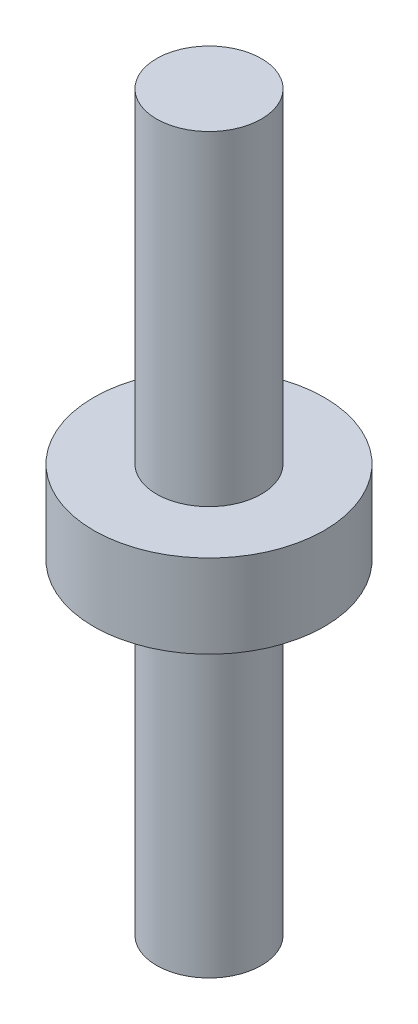
ISO-10303-21;
HEADER;
FILE_DESCRIPTION(('STEP AP214'),'2;1');
FILE_NAME('part.step','',(''),(''),'','','');
FILE_SCHEMA(('AUTOMOTIVE_DESIGN { 1 0 10303 214 1 1 1 1 }'));
ENDSEC;
DATA;
#1=APPLICATION_CONTEXT('core data for automotive mechanical design processes');
#2=APPLICATION_PROTOCOL_DEFINITION('international standard','automotive_design',2000,#1);
#3=PRODUCT_CONTEXT('',#1,'mechanical');
#4=PRODUCT('Part','Part','',(#3));
#5=PRODUCT_RELATED_PRODUCT_CATEGORY('part','',(#4));
#6=PRODUCT_DEFINITION_FORMATION('','',#4);
#7=PRODUCT_DEFINITION_CONTEXT('part definition',#1,'design');
#8=PRODUCT_DEFINITION('design','',#6,#7);
#9=PRODUCT_DEFINITION_SHAPE('','',#8);
#10=(LENGTH_UNIT() NAMED_UNIT(*) SI_UNIT(.MILLI.,.METRE.));
#11=(NAMED_UNIT(*) PLANE_ANGLE_UNIT() SI_UNIT($,.RADIAN.));
#12=(NAMED_UNIT(*) SI_UNIT($,.STERADIAN.) SOLID_ANGLE_UNIT());
#13=UNCERTAINTY_MEASURE_WITH_UNIT(LENGTH_MEASURE(1.E-05),#10,'distance_accuracy_value','');
#14=(GEOMETRIC_REPRESENTATION_CONTEXT(3) GLOBAL_UNCERTAINTY_ASSIGNED_CONTEXT((#13)) GLOBAL_UNIT_ASSIGNED_CONTEXT((#10,
#11,#12)) REPRESENTATION_CONTEXT('',''));
#15=CARTESIAN_POINT('',(0.,0.,0.));
#16=DIRECTION('',(0.,0.,1.));
#17=DIRECTION('',(1.,0.,0.));
#18=AXIS2_PLACEMENT_3D('',#15,#16,#17);
#19=CARTESIAN_POINT('',(0.,31.,0.));
#20=DIRECTION('',(0.,-1.,0.));
#21=DIRECTION('',(0.,0.,-1.));
#22=AXIS2_PLACEMENT_3D('',#19,#20,#21);
#23=CYLINDRICAL_SURFACE('',#22,5.);
#24=CARTESIAN_POINT('',(0.,31.,0.));
#25=DIRECTION('',(0.,1.,0.));
#26=DIRECTION('',(0.,0.,1.));
#27=AXIS2_PLACEMENT_3D('',#24,#25,#26);
#28=CIRCLE('',#27,5.);
#29=CARTESIAN_POINT('',(0.,31.,5.));
#30=VERTEX_POINT('',#29);
#31=EDGE_CURVE('E45',#30,#30,#28,.T.);
#32=ORIENTED_EDGE('',*,*,#31,.F.);
#33=EDGE_LOOP('',(#32));
#34=FACE_BOUND('',#33,.T.);
#35=CARTESIAN_POINT('',(0.,0.,0.));
#36=DIRECTION('',(0.,1.,0.));
#37=DIRECTION('',(0.,0.,1.));
#38=AXIS2_PLACEMENT_3D('',#35,#36,#37);
#39=CIRCLE('',#38,5.);
#40=CARTESIAN_POINT('',(0.,0.,5.));
#41=VERTEX_POINT('',#40);
#42=EDGE_CURVE('E40',#41,#41,#39,.T.);
#43=ORIENTED_EDGE('',*,*,#42,.T.);
#44=EDGE_LOOP('',(#43));
#45=FACE_BOUND('',#44,.T.);
#46=ADVANCED_FACE('F37',(#34,#45),#23,.T.);
#47=CARTESIAN_POINT('',(0.,0.,0.));
#48=DIRECTION('',(0.,1.,0.));
#49=DIRECTION('',(0.,0.,1.));
#50=AXIS2_PLACEMENT_3D('',#47,#48,#49);
#51=PLANE('',#50);
#52=ORIENTED_EDGE('',*,*,#42,.F.);
#53=EDGE_LOOP('',(#52));
#54=FACE_BOUND('',#53,.T.);
#55=ADVANCED_FACE('F83',(#54),#51,.F.);
#56=CARTESIAN_POINT('',(0.,38.95,0.));
#57=DIRECTION('',(0.,-1.,0.));
#58=DIRECTION('',(0.,0.,-1.));
#59=AXIS2_PLACEMENT_3D('',#56,#57,#58);
#60=CYLINDRICAL_SURFACE('',#59,11.);
#61=CARTESIAN_POINT('',(0.,38.95,0.));
#62=DIRECTION('',(0.,1.,0.));
#63=DIRECTION('',(0.,0.,1.));
#64=AXIS2_PLACEMENT_3D('',#61,#62,#63);
#65=CIRCLE('',#64,11.);
#66=CARTESIAN_POINT('',(0.,38.95,11.));
#67=VERTEX_POINT('',#66);
#68=EDGE_CURVE('E54',#67,#67,#65,.T.);
#69=ORIENTED_EDGE('',*,*,#68,.F.);
#70=EDGE_LOOP('',(#69));
#71=FACE_BOUND('',#70,.T.);
#72=CARTESIAN_POINT('',(0.,31.,0.));
#73=DIRECTION('',(0.,1.,0.));
#74=DIRECTION('',(0.,0.,1.));
#75=AXIS2_PLACEMENT_3D('',#72,#73,#74);
#76=CIRCLE('',#75,11.);
#77=CARTESIAN_POINT('',(0.,31.,11.));
#78=VERTEX_POINT('',#77);
#79=EDGE_CURVE('E58',#78,#78,#76,.T.);
#80=ORIENTED_EDGE('',*,*,#79,.T.);
#81=EDGE_LOOP('',(#80));
#82=FACE_BOUND('',#81,.T.);
#83=ADVANCED_FACE('F88',(#71,#82),#60,.T.);
#84=CARTESIAN_POINT('',(0.,38.95,0.));
#85=DIRECTION('',(0.,1.,0.));
#86=DIRECTION('',(0.,0.,1.));
#87=AXIS2_PLACEMENT_3D('',#84,#85,#86);
#88=PLANE('',#87);
#89=CARTESIAN_POINT('',(0.,38.95,0.));
#90=DIRECTION('',(0.,1.,0.));
#91=DIRECTION('',(0.,0.,1.));
#92=AXIS2_PLACEMENT_3D('',#89,#90,#91);
#93=CIRCLE('',#92,5.);
#94=CARTESIAN_POINT('',(0.,38.95,5.));
#95=VERTEX_POINT('',#94);
#96=EDGE_CURVE('E10',#95,#95,#93,.T.);
#97=ORIENTED_EDGE('',*,*,#96,.F.);
#98=EDGE_LOOP('',(#97));
#99=FACE_BOUND('',#98,.T.);
#100=ORIENTED_EDGE('',*,*,#68,.T.);
#101=EDGE_LOOP('',(#100));
#102=FACE_BOUND('',#101,.T.);
#103=ADVANCED_FACE('F78',(#99,#102),#88,.T.);
#104=CARTESIAN_POINT('',(0.,31.,0.));
#105=DIRECTION('',(0.,1.,0.));
#106=DIRECTION('',(0.,0.,1.));
#107=AXIS2_PLACEMENT_3D('',#104,#105,#106);
#108=PLANE('',#107);
#109=ORIENTED_EDGE('',*,*,#31,.T.);
#110=EDGE_LOOP('',(#109));
#111=FACE_BOUND('',#110,.T.);
#112=ORIENTED_EDGE('',*,*,#79,.F.);
#113=EDGE_LOOP('',(#112));
#114=FACE_BOUND('',#113,.T.);
#115=ADVANCED_FACE('F71',(#111,#114),#108,.F.);
#116=CARTESIAN_POINT('',(0.,69.95,0.));
#117=DIRECTION('',(0.,-1.,0.));
#118=DIRECTION('',(0.,0.,-1.));
#119=AXIS2_PLACEMENT_3D('',#116,#117,#118);
#120=CYLINDRICAL_SURFACE('',#119,5.);
#121=CARTESIAN_POINT('',(0.,69.95,0.));
#122=DIRECTION('',(0.,1.,0.));
#123=DIRECTION('',(0.,0.,1.));
#124=AXIS2_PLACEMENT_3D('',#121,#122,#123);
#125=CIRCLE('',#124,5.);
#126=CARTESIAN_POINT('',(0.,69.95,5.));
#127=VERTEX_POINT('',#126);
#128=EDGE_CURVE('E53',#127,#127,#125,.T.);
#129=ORIENTED_EDGE('',*,*,#128,.F.);
#130=EDGE_LOOP('',(#129));
#131=FACE_BOUND('',#130,.T.);
#132=ORIENTED_EDGE('',*,*,#96,.T.);
#133=EDGE_LOOP('',(#132));
#134=FACE_BOUND('',#133,.T.);
#135=ADVANCED_FACE('F69',(#131,#134),#120,.T.);
#136=CARTESIAN_POINT('',(0.,69.95,0.));
#137=DIRECTION('',(0.,1.,0.));
#138=DIRECTION('',(0.,0.,1.));
#139=AXIS2_PLACEMENT_3D('',#136,#137,#138);
#140=PLANE('',#139);
#141=ORIENTED_EDGE('',*,*,#128,.T.);
#142=EDGE_LOOP('',(#141));
#143=FACE_BOUND('',#142,.T.);
#144=ADVANCED_FACE('F67',(#143),#140,.T.);
#145=CLOSED_SHELL('',(#46,#55,#83,#103,#115,#135,#144));
#146=MANIFOLD_SOLID_BREP('B2',#145);
#147=ADVANCED_BREP_SHAPE_REPRESENTATION('',(#18,#146),#14);
#148=SHAPE_DEFINITION_REPRESENTATION(#9,#147);
ENDSEC;
END-ISO-10303-21;
